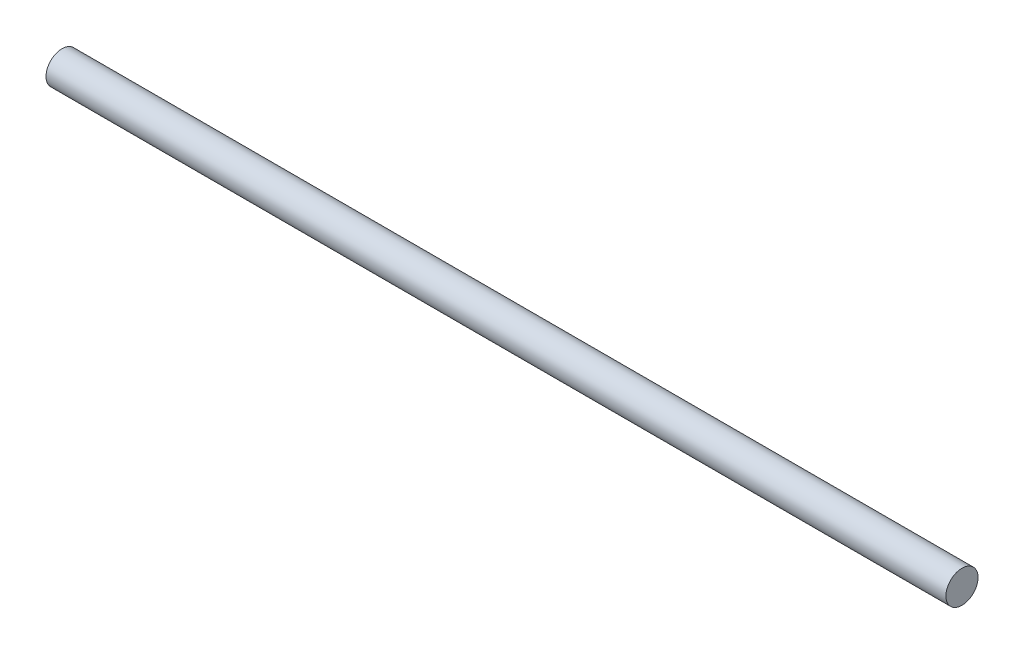
ISO-10303-21;
HEADER;
FILE_DESCRIPTION(('STEP AP214'),'2;1');
FILE_NAME('part.step','',(''),(''),'','','');
FILE_SCHEMA(('AUTOMOTIVE_DESIGN { 1 0 10303 214 1 1 1 1 }'));
ENDSEC;
DATA;
#1=APPLICATION_CONTEXT('core data for automotive mechanical design processes');
#2=APPLICATION_PROTOCOL_DEFINITION('international standard','automotive_design',2000,#1);
#3=PRODUCT_CONTEXT('',#1,'mechanical');
#4=PRODUCT('Part','Part','',(#3));
#5=PRODUCT_RELATED_PRODUCT_CATEGORY('part','',(#4));
#6=PRODUCT_DEFINITION_FORMATION('','',#4);
#7=PRODUCT_DEFINITION_CONTEXT('part definition',#1,'design');
#8=PRODUCT_DEFINITION('design','',#6,#7);
#9=PRODUCT_DEFINITION_SHAPE('','',#8);
#10=(LENGTH_UNIT() NAMED_UNIT(*) SI_UNIT(.MILLI.,.METRE.));
#11=(NAMED_UNIT(*) PLANE_ANGLE_UNIT() SI_UNIT($,.RADIAN.));
#12=(NAMED_UNIT(*) SI_UNIT($,.STERADIAN.) SOLID_ANGLE_UNIT());
#13=UNCERTAINTY_MEASURE_WITH_UNIT(LENGTH_MEASURE(1.E-05),#10,'distance_accuracy_value','');
#14=(GEOMETRIC_REPRESENTATION_CONTEXT(3) GLOBAL_UNCERTAINTY_ASSIGNED_CONTEXT((#13)) GLOBAL_UNIT_ASSIGNED_CONTEXT((#10,
#11,#12)) REPRESENTATION_CONTEXT('',''));
#15=CARTESIAN_POINT('',(0.,0.,0.));
#16=DIRECTION('',(0.,0.,1.));
#17=DIRECTION('',(1.,0.,0.));
#18=AXIS2_PLACEMENT_3D('',#15,#16,#17);
#19=CARTESIAN_POINT('',(112.,-2.,0.));
#20=DIRECTION('',(-1.,0.,0.));
#21=DIRECTION('',(0.,0.,1.));
#22=AXIS2_PLACEMENT_3D('',#19,#20,#21);
#23=PLANE('',#22);
#24=CARTESIAN_POINT('',(112.,-2.,0.));
#25=DIRECTION('',(-1.,0.,0.));
#26=DIRECTION('',(0.,0.,1.));
#27=AXIS2_PLACEMENT_3D('',#24,#25,#26);
#28=CIRCLE('',#27,4.);
#29=CARTESIAN_POINT('',(112.,-2.,4.));
#30=VERTEX_POINT('',#29);
#31=EDGE_CURVE('E37',#30,#30,#28,.T.);
#32=ORIENTED_EDGE('',*,*,#31,.F.);
#33=EDGE_LOOP('',(#32));
#34=FACE_BOUND('',#33,.T.);
#35=ADVANCED_FACE('F31',(#34),#23,.F.);
#36=CARTESIAN_POINT('',(-112.,-2.,0.));
#37=DIRECTION('',(1.,0.,0.));
#38=DIRECTION('',(0.,0.,-1.));
#39=AXIS2_PLACEMENT_3D('',#36,#37,#38);
#40=PLANE('',#39);
#41=CARTESIAN_POINT('',(-112.,-2.,0.));
#42=DIRECTION('',(-1.,0.,0.));
#43=DIRECTION('',(0.,0.,1.));
#44=AXIS2_PLACEMENT_3D('',#41,#42,#43);
#45=CIRCLE('',#44,4.);
#46=CARTESIAN_POINT('',(-112.,-2.,4.));
#47=VERTEX_POINT('',#46);
#48=EDGE_CURVE('E10',#47,#47,#45,.T.);
#49=ORIENTED_EDGE('',*,*,#48,.T.);
#50=EDGE_LOOP('',(#49));
#51=FACE_BOUND('',#50,.T.);
#52=ADVANCED_FACE('F46',(#51),#40,.F.);
#53=CARTESIAN_POINT('',(-112.,-2.,0.));
#54=DIRECTION('',(-1.,0.,0.));
#55=DIRECTION('',(0.,0.,1.));
#56=AXIS2_PLACEMENT_3D('',#53,#54,#55);
#57=CYLINDRICAL_SURFACE('',#56,4.);
#58=ORIENTED_EDGE('',*,*,#48,.F.);
#59=EDGE_LOOP('',(#58));
#60=FACE_BOUND('',#59,.T.);
#61=ORIENTED_EDGE('',*,*,#31,.T.);
#62=EDGE_LOOP('',(#61));
#63=FACE_BOUND('',#62,.T.);
#64=ADVANCED_FACE('F43',(#60,#63),#57,.T.);
#65=CLOSED_SHELL('',(#35,#52,#64));
#66=MANIFOLD_SOLID_BREP('B2',#65);
#67=ADVANCED_BREP_SHAPE_REPRESENTATION('',(#18,#66),#14);
#68=SHAPE_DEFINITION_REPRESENTATION(#9,#67);
ENDSEC;
END-ISO-10303-21;
